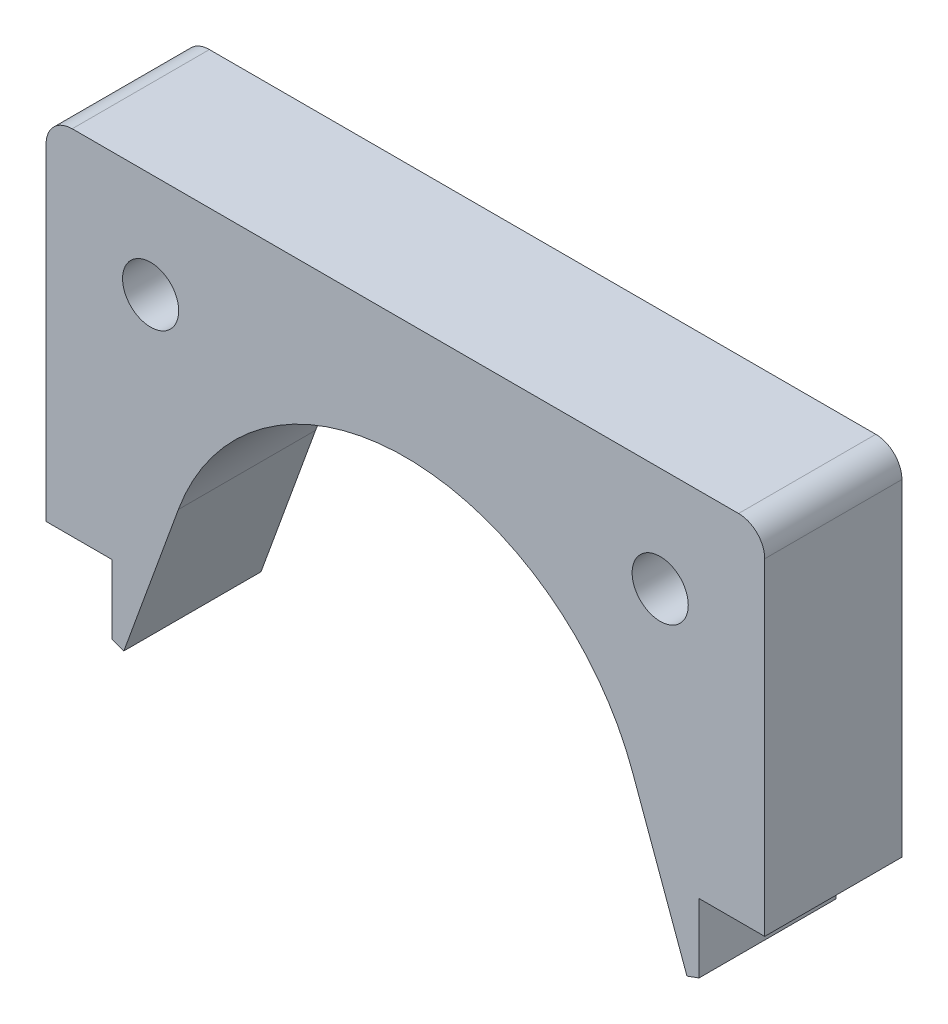
ISO-10303-21;
HEADER;
FILE_DESCRIPTION(('STEP AP214'),'2;1');
FILE_NAME('part.step','',(''),(''),'','','');
FILE_SCHEMA(('AUTOMOTIVE_DESIGN { 1 0 10303 214 1 1 1 1 }'));
ENDSEC;
DATA;
#1=APPLICATION_CONTEXT('core data for automotive mechanical design processes');
#2=APPLICATION_PROTOCOL_DEFINITION('international standard','automotive_design',2000,#1);
#3=PRODUCT_CONTEXT('',#1,'mechanical');
#4=PRODUCT('Part','Part','',(#3));
#5=PRODUCT_RELATED_PRODUCT_CATEGORY('part','',(#4));
#6=PRODUCT_DEFINITION_FORMATION('','',#4);
#7=PRODUCT_DEFINITION_CONTEXT('part definition',#1,'design');
#8=PRODUCT_DEFINITION('design','',#6,#7);
#9=PRODUCT_DEFINITION_SHAPE('','',#8);
#10=(LENGTH_UNIT() NAMED_UNIT(*) SI_UNIT(.MILLI.,.METRE.));
#11=(NAMED_UNIT(*) PLANE_ANGLE_UNIT() SI_UNIT($,.RADIAN.));
#12=(NAMED_UNIT(*) SI_UNIT($,.STERADIAN.) SOLID_ANGLE_UNIT());
#13=UNCERTAINTY_MEASURE_WITH_UNIT(LENGTH_MEASURE(1.E-05),#10,'distance_accuracy_value','');
#14=(GEOMETRIC_REPRESENTATION_CONTEXT(3) GLOBAL_UNCERTAINTY_ASSIGNED_CONTEXT((#13)) GLOBAL_UNIT_ASSIGNED_CONTEXT((#10,
#11,#12)) REPRESENTATION_CONTEXT('',''));
#15=CARTESIAN_POINT('',(0.,0.,0.));
#16=DIRECTION('',(0.,0.,1.));
#17=DIRECTION('',(1.,0.,0.));
#18=AXIS2_PLACEMENT_3D('',#15,#16,#17);
#19=CARTESIAN_POINT('',(36.4185981872808,-21.5595176241731,10.5));
#20=DIRECTION('',(0.,0.,-1.));
#21=DIRECTION('',(-1.,0.,0.));
#22=AXIS2_PLACEMENT_3D('',#19,#20,#21);
#23=PLANE('',#22);
#24=CARTESIAN_POINT('',(55.9185981872808,-2.05951762417312,10.5));
#25=DIRECTION('',(0.,0.,1.));
#26=DIRECTION('',(1.,0.,0.));
#27=AXIS2_PLACEMENT_3D('',#24,#25,#26);
#28=CIRCLE('',#27,2.15000000000002);
#29=CARTESIAN_POINT('',(58.0685981872808,-2.05951762417312,10.5));
#30=VERTEX_POINT('',#29);
#31=EDGE_CURVE('E269',#30,#30,#28,.T.);
#32=ORIENTED_EDGE('',*,*,#31,.F.);
#33=EDGE_LOOP('',(#32));
#34=FACE_BOUND('',#33,.T.);
#35=DIRECTION('',(0.,1.,0.));
#36=VECTOR('',#35,1.);
#37=CARTESIAN_POINT('',(63.9185981872808,-21.0906513065701,10.5));
#38=LINE('',#37,#36);
#39=CARTESIAN_POINT('',(63.9185981872808,-21.0906513065701,10.5));
#40=VERTEX_POINT('',#39);
#41=CARTESIAN_POINT('',(63.9185981872808,3.94048237582689,10.5));
#42=VERTEX_POINT('',#41);
#43=EDGE_CURVE('E180',#40,#42,#38,.T.);
#44=ORIENTED_EDGE('',*,*,#43,.T.);
#45=CARTESIAN_POINT('',(61.9185981872808,3.94048237582689,10.5));
#46=DIRECTION('',(0.,0.,-1.));
#47=DIRECTION('',(-1.,0.,0.));
#48=AXIS2_PLACEMENT_3D('',#45,#46,#47);
#49=CIRCLE('',#48,2.);
#50=CARTESIAN_POINT('',(61.9185981872808,5.94048237582689,10.5));
#51=VERTEX_POINT('',#50);
#52=EDGE_CURVE('E43',#42,#51,#49,.F.);
#53=ORIENTED_EDGE('',*,*,#52,.T.);
#54=DIRECTION('',(-1.,0.,0.));
#55=VECTOR('',#54,1.);
#56=CARTESIAN_POINT('',(63.9185981872808,5.94048237582689,10.5));
#57=LINE('',#56,#55);
#58=CARTESIAN_POINT('',(10.9185981872808,5.94048237582689,10.5));
#59=VERTEX_POINT('',#58);
#60=EDGE_CURVE('E179',#51,#59,#57,.T.);
#61=ORIENTED_EDGE('',*,*,#60,.T.);
#62=CARTESIAN_POINT('',(10.9185981872808,3.94048237582689,10.5));
#63=DIRECTION('',(0.,0.,-1.));
#64=DIRECTION('',(-1.,0.,0.));
#65=AXIS2_PLACEMENT_3D('',#62,#63,#64);
#66=CIRCLE('',#65,2.);
#67=CARTESIAN_POINT('',(8.91859818728076,3.94048237582689,10.5));
#68=VERTEX_POINT('',#67);
#69=EDGE_CURVE('E50',#59,#68,#66,.F.);
#70=ORIENTED_EDGE('',*,*,#69,.T.);
#71=DIRECTION('',(0.,-1.,0.));
#72=VECTOR('',#71,1.);
#73=CARTESIAN_POINT('',(8.91859818728076,5.94048237582689,10.5));
#74=LINE('',#73,#72);
#75=CARTESIAN_POINT('',(8.91859818728076,-21.0906513065701,10.5));
#76=VERTEX_POINT('',#75);
#77=EDGE_CURVE('E153',#68,#76,#74,.T.);
#78=ORIENTED_EDGE('',*,*,#77,.T.);
#79=DIRECTION('',(1.,0.,0.));
#80=VECTOR('',#79,1.);
#81=CARTESIAN_POINT('',(8.91859818728076,-21.0906513065701,10.5));
#82=LINE('',#81,#80);
#83=CARTESIAN_POINT('',(13.9441377314609,-21.0906513065701,10.5));
#84=VERTEX_POINT('',#83);
#85=EDGE_CURVE('E149',#76,#84,#82,.T.);
#86=ORIENTED_EDGE('',*,*,#85,.T.);
#87=DIRECTION('',(0.,-1.,0.));
#88=VECTOR('',#87,1.);
#89=CARTESIAN_POINT('',(13.9441377314609,-21.0906513065701,10.5));
#90=LINE('',#89,#88);
#91=CARTESIAN_POINT('',(13.9441377314609,-26.3610038868778,10.5));
#92=VERTEX_POINT('',#91);
#93=EDGE_CURVE('E139',#84,#92,#90,.T.);
#94=ORIENTED_EDGE('',*,*,#93,.T.);
#95=DIRECTION('',(0.939692620785909,-0.342020143325667,0.));
#96=VECTOR('',#95,1.);
#97=CARTESIAN_POINT('',(13.9441377314609,-26.3610038868778,10.5));
#98=LINE('',#97,#96);
#99=CARTESIAN_POINT('',(14.8693353880782,-26.6977482946993,10.5));
#100=VERTEX_POINT('',#99);
#101=EDGE_CURVE('E148',#92,#100,#98,.T.);
#102=ORIENTED_EDGE('',*,*,#101,.T.);
#103=DIRECTION('',(0.342020143325666,0.93969262078591,0.));
#104=VECTOR('',#103,1.);
#105=CARTESIAN_POINT('',(14.8693353880782,-26.6977482946993,10.5));
#106=LINE('',#105,#104);
#107=CARTESIAN_POINT('',(19.0415157827224,-15.234776870523,10.5));
#108=VERTEX_POINT('',#107);
#109=EDGE_CURVE('E234',#100,#108,#106,.T.);
#110=ORIENTED_EDGE('',*,*,#109,.T.);
#111=CARTESIAN_POINT('',(36.4185981872808,-21.5595176241731,10.5));
#112=DIRECTION('',(0.,0.,-1.));
#113=DIRECTION('',(-1.,0.,0.));
#114=AXIS2_PLACEMENT_3D('',#111,#112,#113);
#115=CIRCLE('',#114,18.4923048454133);
#116=CARTESIAN_POINT('',(53.7956805918391,-15.234776870523,10.5));
#117=VERTEX_POINT('',#116);
#118=EDGE_CURVE('E272',#108,#117,#115,.T.);
#119=ORIENTED_EDGE('',*,*,#118,.T.);
#120=DIRECTION('',(0.342020143325666,-0.939692620785909,0.));
#121=VECTOR('',#120,1.);
#122=CARTESIAN_POINT('',(53.7956805918391,-15.234776870523,10.5));
#123=LINE('',#122,#121);
#124=CARTESIAN_POINT('',(57.9678609864833,-26.6977482946993,10.5));
#125=VERTEX_POINT('',#124);
#126=EDGE_CURVE('E276',#117,#125,#123,.T.);
#127=ORIENTED_EDGE('',*,*,#126,.T.);
#128=DIRECTION('',(0.939692620785906,0.342020143325675,0.));
#129=VECTOR('',#128,1.);
#130=CARTESIAN_POINT('',(57.9678609864833,-26.6977482946993,10.5));
#131=LINE('',#130,#129);
#132=CARTESIAN_POINT('',(58.8930586431006,-26.3610038868778,10.5));
#133=VERTEX_POINT('',#132);
#134=EDGE_CURVE('E264',#125,#133,#131,.T.);
#135=ORIENTED_EDGE('',*,*,#134,.T.);
#136=DIRECTION('',(0.,1.,0.));
#137=VECTOR('',#136,1.);
#138=CARTESIAN_POINT('',(58.8930586431007,-21.0906513065701,10.5));
#139=LINE('',#138,#137);
#140=CARTESIAN_POINT('',(58.8930586431007,-21.0906513065701,10.5));
#141=VERTEX_POINT('',#140);
#142=EDGE_CURVE('E261',#133,#141,#139,.T.);
#143=ORIENTED_EDGE('',*,*,#142,.T.);
#144=DIRECTION('',(1.,0.,0.));
#145=VECTOR('',#144,1.);
#146=CARTESIAN_POINT('',(63.9185981872808,-21.0906513065701,10.5));
#147=LINE('',#146,#145);
#148=EDGE_CURVE('E260',#141,#40,#147,.T.);
#149=ORIENTED_EDGE('',*,*,#148,.T.);
#150=EDGE_LOOP('',(#44,#53,#61,#70,#78,#86,#94,#102,#110,#119,#127,#135,#143,#149));
#151=FACE_BOUND('',#150,.T.);
#152=CARTESIAN_POINT('',(16.9185981872808,-2.05951762417312,10.5));
#153=DIRECTION('',(0.,0.,1.));
#154=DIRECTION('',(1.,0.,0.));
#155=AXIS2_PLACEMENT_3D('',#152,#153,#154);
#156=CIRCLE('',#155,2.15);
#157=CARTESIAN_POINT('',(19.0685981872808,-2.05951762417312,10.5));
#158=VERTEX_POINT('',#157);
#159=EDGE_CURVE('E445',#158,#158,#156,.T.);
#160=ORIENTED_EDGE('',*,*,#159,.F.);
#161=EDGE_LOOP('',(#160));
#162=FACE_BOUND('',#161,.T.);
#163=ADVANCED_FACE('F35',(#34,#151,#162),#23,.F.);
#164=CARTESIAN_POINT('',(36.4185981872808,-21.5595176241731,0.));
#165=DIRECTION('',(0.,0.,-1.));
#166=DIRECTION('',(-1.,0.,0.));
#167=AXIS2_PLACEMENT_3D('',#164,#165,#166);
#168=PLANE('',#167);
#169=CARTESIAN_POINT('',(55.9185981872808,-2.05951762417312,0.));
#170=DIRECTION('',(0.,0.,1.));
#171=DIRECTION('',(1.,0.,0.));
#172=AXIS2_PLACEMENT_3D('',#169,#170,#171);
#173=CIRCLE('',#172,2.15000000000002);
#174=CARTESIAN_POINT('',(58.0685981872808,-2.05951762417312,0.));
#175=VERTEX_POINT('',#174);
#176=EDGE_CURVE('E450',#175,#175,#173,.T.);
#177=ORIENTED_EDGE('',*,*,#176,.T.);
#178=EDGE_LOOP('',(#177));
#179=FACE_BOUND('',#178,.T.);
#180=DIRECTION('',(-1.,0.,0.));
#181=VECTOR('',#180,1.);
#182=CARTESIAN_POINT('',(63.9185981872808,5.94048237582689,0.));
#183=LINE('',#182,#181);
#184=CARTESIAN_POINT('',(61.9185981872808,5.94048237582689,0.));
#185=VERTEX_POINT('',#184);
#186=CARTESIAN_POINT('',(10.9185981872808,5.94048237582689,0.));
#187=VERTEX_POINT('',#186);
#188=EDGE_CURVE('E196',#185,#187,#183,.T.);
#189=ORIENTED_EDGE('',*,*,#188,.F.);
#190=CARTESIAN_POINT('',(61.9185981872808,3.94048237582689,0.));
#191=DIRECTION('',(0.,0.,-1.));
#192=DIRECTION('',(-1.,0.,0.));
#193=AXIS2_PLACEMENT_3D('',#190,#191,#192);
#194=CIRCLE('',#193,2.);
#195=CARTESIAN_POINT('',(63.9185981872808,3.94048237582689,0.));
#196=VERTEX_POINT('',#195);
#197=EDGE_CURVE('E174',#185,#196,#194,.T.);
#198=ORIENTED_EDGE('',*,*,#197,.T.);
#199=DIRECTION('',(0.,1.,0.));
#200=VECTOR('',#199,1.);
#201=CARTESIAN_POINT('',(63.9185981872808,-21.0906513065701,0.));
#202=LINE('',#201,#200);
#203=CARTESIAN_POINT('',(63.9185981872808,-21.0906513065701,0.));
#204=VERTEX_POINT('',#203);
#205=EDGE_CURVE('E195',#204,#196,#202,.T.);
#206=ORIENTED_EDGE('',*,*,#205,.F.);
#207=DIRECTION('',(1.,0.,0.));
#208=VECTOR('',#207,1.);
#209=CARTESIAN_POINT('',(63.9185981872808,-21.0906513065701,0.));
#210=LINE('',#209,#208);
#211=CARTESIAN_POINT('',(58.8930586431007,-21.0906513065701,0.));
#212=VERTEX_POINT('',#211);
#213=EDGE_CURVE('E201',#212,#204,#210,.T.);
#214=ORIENTED_EDGE('',*,*,#213,.F.);
#215=DIRECTION('',(0.,1.,0.));
#216=VECTOR('',#215,1.);
#217=CARTESIAN_POINT('',(58.8930586431007,-21.0906513065701,0.));
#218=LINE('',#217,#216);
#219=CARTESIAN_POINT('',(58.8930586431006,-26.3610038868778,0.));
#220=VERTEX_POINT('',#219);
#221=EDGE_CURVE('E204',#220,#212,#218,.T.);
#222=ORIENTED_EDGE('',*,*,#221,.F.);
#223=DIRECTION('',(0.939692620785906,0.342020143325675,0.));
#224=VECTOR('',#223,1.);
#225=CARTESIAN_POINT('',(57.9678609864833,-26.6977482946993,0.));
#226=LINE('',#225,#224);
#227=CARTESIAN_POINT('',(57.9678609864833,-26.6977482946993,0.));
#228=VERTEX_POINT('',#227);
#229=EDGE_CURVE('E249',#228,#220,#226,.T.);
#230=ORIENTED_EDGE('',*,*,#229,.F.);
#231=DIRECTION('',(0.342020143325666,-0.939692620785909,0.));
#232=VECTOR('',#231,1.);
#233=CARTESIAN_POINT('',(53.7956805918391,-15.234776870523,0.));
#234=LINE('',#233,#232);
#235=CARTESIAN_POINT('',(53.7956805918391,-15.234776870523,0.));
#236=VERTEX_POINT('',#235);
#237=EDGE_CURVE('E242',#236,#228,#234,.T.);
#238=ORIENTED_EDGE('',*,*,#237,.F.);
#239=CARTESIAN_POINT('',(36.4185981872808,-21.5595176241731,0.));
#240=DIRECTION('',(0.,0.,-1.));
#241=DIRECTION('',(-1.,0.,0.));
#242=AXIS2_PLACEMENT_3D('',#239,#240,#241);
#243=CIRCLE('',#242,18.4923048454133);
#244=CARTESIAN_POINT('',(19.0415157827224,-15.234776870523,0.));
#245=VERTEX_POINT('',#244);
#246=EDGE_CURVE('E240',#245,#236,#243,.T.);
#247=ORIENTED_EDGE('',*,*,#246,.F.);
#248=DIRECTION('',(0.342020143325666,0.93969262078591,0.));
#249=VECTOR('',#248,1.);
#250=CARTESIAN_POINT('',(14.8693353880782,-26.6977482946993,0.));
#251=LINE('',#250,#249);
#252=CARTESIAN_POINT('',(14.8693353880782,-26.6977482946993,0.));
#253=VERTEX_POINT('',#252);
#254=EDGE_CURVE('E233',#253,#245,#251,.T.);
#255=ORIENTED_EDGE('',*,*,#254,.F.);
#256=DIRECTION('',(0.939692620785909,-0.342020143325667,0.));
#257=VECTOR('',#256,1.);
#258=CARTESIAN_POINT('',(13.9441377314609,-26.3610038868778,0.));
#259=LINE('',#258,#257);
#260=CARTESIAN_POINT('',(13.9441377314609,-26.3610038868778,0.));
#261=VERTEX_POINT('',#260);
#262=EDGE_CURVE('E238',#261,#253,#259,.T.);
#263=ORIENTED_EDGE('',*,*,#262,.F.);
#264=DIRECTION('',(0.,-1.,0.));
#265=VECTOR('',#264,1.);
#266=CARTESIAN_POINT('',(13.9441377314609,-21.0906513065701,0.));
#267=LINE('',#266,#265);
#268=CARTESIAN_POINT('',(13.9441377314609,-21.0906513065701,0.));
#269=VERTEX_POINT('',#268);
#270=EDGE_CURVE('E244',#269,#261,#267,.T.);
#271=ORIENTED_EDGE('',*,*,#270,.F.);
#272=DIRECTION('',(1.,0.,0.));
#273=VECTOR('',#272,1.);
#274=CARTESIAN_POINT('',(8.91859818728076,-21.0906513065701,0.));
#275=LINE('',#274,#273);
#276=CARTESIAN_POINT('',(8.91859818728076,-21.0906513065701,0.));
#277=VERTEX_POINT('',#276);
#278=EDGE_CURVE('E161',#277,#269,#275,.T.);
#279=ORIENTED_EDGE('',*,*,#278,.F.);
#280=DIRECTION('',(0.,-1.,0.));
#281=VECTOR('',#280,1.);
#282=CARTESIAN_POINT('',(8.91859818728076,5.94048237582689,0.));
#283=LINE('',#282,#281);
#284=CARTESIAN_POINT('',(8.91859818728076,3.94048237582689,0.));
#285=VERTEX_POINT('',#284);
#286=EDGE_CURVE('E157',#285,#277,#283,.T.);
#287=ORIENTED_EDGE('',*,*,#286,.F.);
#288=CARTESIAN_POINT('',(10.9185981872808,3.94048237582689,0.));
#289=DIRECTION('',(0.,0.,-1.));
#290=DIRECTION('',(-1.,0.,0.));
#291=AXIS2_PLACEMENT_3D('',#288,#289,#290);
#292=CIRCLE('',#291,2.);
#293=EDGE_CURVE('E172',#285,#187,#292,.T.);
#294=ORIENTED_EDGE('',*,*,#293,.T.);
#295=EDGE_LOOP('',(#189,#198,#206,#214,#222,#230,#238,#247,#255,#263,#271,#279,#287,#294));
#296=FACE_BOUND('',#295,.T.);
#297=CARTESIAN_POINT('',(16.9185981872808,-2.05951762417312,0.));
#298=DIRECTION('',(0.,0.,1.));
#299=DIRECTION('',(1.,0.,0.));
#300=AXIS2_PLACEMENT_3D('',#297,#298,#299);
#301=CIRCLE('',#300,2.15);
#302=CARTESIAN_POINT('',(19.0685981872808,-2.05951762417312,0.));
#303=VERTEX_POINT('',#302);
#304=EDGE_CURVE('E448',#303,#303,#301,.T.);
#305=ORIENTED_EDGE('',*,*,#304,.T.);
#306=EDGE_LOOP('',(#305));
#307=FACE_BOUND('',#306,.T.);
#308=ADVANCED_FACE('F192',(#179,#296,#307),#168,.T.);
#309=CARTESIAN_POINT('',(8.91859818728076,-21.0906513065701,10.5));
#310=DIRECTION('',(0.,1.,0.));
#311=DIRECTION('',(0.,0.,1.));
#312=AXIS2_PLACEMENT_3D('',#309,#310,#311);
#313=PLANE('',#312);
#314=ORIENTED_EDGE('',*,*,#278,.T.);
#315=DIRECTION('',(0.,0.,-1.));
#316=VECTOR('',#315,1.);
#317=CARTESIAN_POINT('',(13.9441377314609,-21.0906513065701,10.5));
#318=LINE('',#317,#316);
#319=EDGE_CURVE('E143',#84,#269,#318,.T.);
#320=ORIENTED_EDGE('',*,*,#319,.F.);
#321=ORIENTED_EDGE('',*,*,#85,.F.);
#322=DIRECTION('',(0.,0.,-1.));
#323=VECTOR('',#322,1.);
#324=CARTESIAN_POINT('',(8.91859818728076,-21.0906513065701,10.5));
#325=LINE('',#324,#323);
#326=EDGE_CURVE('E209',#76,#277,#325,.T.);
#327=ORIENTED_EDGE('',*,*,#326,.T.);
#328=EDGE_LOOP('',(#314,#320,#321,#327));
#329=FACE_BOUND('',#328,.T.);
#330=ADVANCED_FACE('F159',(#329),#313,.F.);
#331=CARTESIAN_POINT('',(13.9441377314609,-21.0906513065701,10.5));
#332=DIRECTION('',(1.,0.,0.));
#333=DIRECTION('',(0.,0.,-1.));
#334=AXIS2_PLACEMENT_3D('',#331,#332,#333);
#335=PLANE('',#334);
#336=ORIENTED_EDGE('',*,*,#270,.T.);
#337=DIRECTION('',(0.,0.,-1.));
#338=VECTOR('',#337,1.);
#339=CARTESIAN_POINT('',(13.9441377314609,-26.3610038868778,10.5));
#340=LINE('',#339,#338);
#341=EDGE_CURVE('E146',#92,#261,#340,.T.);
#342=ORIENTED_EDGE('',*,*,#341,.F.);
#343=ORIENTED_EDGE('',*,*,#93,.F.);
#344=ORIENTED_EDGE('',*,*,#319,.T.);
#345=EDGE_LOOP('',(#336,#342,#343,#344));
#346=FACE_BOUND('',#345,.T.);
#347=ADVANCED_FACE('F141',(#346),#335,.F.);
#348=CARTESIAN_POINT('',(13.9441377314609,-26.3610038868778,10.5));
#349=DIRECTION('',(0.342020143325667,0.939692620785909,0.));
#350=DIRECTION('',(-0.939692620785909,0.342020143325667,0.));
#351=AXIS2_PLACEMENT_3D('',#348,#349,#350);
#352=PLANE('',#351);
#353=ORIENTED_EDGE('',*,*,#262,.T.);
#354=DIRECTION('',(0.,0.,-1.));
#355=VECTOR('',#354,1.);
#356=CARTESIAN_POINT('',(14.8693353880782,-26.6977482946993,10.5));
#357=LINE('',#356,#355);
#358=EDGE_CURVE('E166',#100,#253,#357,.T.);
#359=ORIENTED_EDGE('',*,*,#358,.F.);
#360=ORIENTED_EDGE('',*,*,#101,.F.);
#361=ORIENTED_EDGE('',*,*,#341,.T.);
#362=EDGE_LOOP('',(#353,#359,#360,#361));
#363=FACE_BOUND('',#362,.T.);
#364=ADVANCED_FACE('F270',(#363),#352,.F.);
#365=CARTESIAN_POINT('',(14.8693353880782,-26.6977482946993,10.5));
#366=DIRECTION('',(-0.93969262078591,0.342020143325666,0.));
#367=DIRECTION('',(-0.342020143325666,-0.93969262078591,0.));
#368=AXIS2_PLACEMENT_3D('',#365,#366,#367);
#369=PLANE('',#368);
#370=ORIENTED_EDGE('',*,*,#254,.T.);
#371=DIRECTION('',(0.,0.,-1.));
#372=VECTOR('',#371,1.);
#373=CARTESIAN_POINT('',(19.0415157827224,-15.234776870523,10.5));
#374=LINE('',#373,#372);
#375=EDGE_CURVE('E224',#108,#245,#374,.T.);
#376=ORIENTED_EDGE('',*,*,#375,.F.);
#377=ORIENTED_EDGE('',*,*,#109,.F.);
#378=ORIENTED_EDGE('',*,*,#358,.T.);
#379=EDGE_LOOP('',(#370,#376,#377,#378));
#380=FACE_BOUND('',#379,.T.);
#381=ADVANCED_FACE('F231',(#380),#369,.F.);
#382=CARTESIAN_POINT('',(36.4185981872808,-21.5595176241731,10.5));
#383=DIRECTION('',(0.,0.,-1.));
#384=DIRECTION('',(-1.,0.,0.));
#385=AXIS2_PLACEMENT_3D('',#382,#383,#384);
#386=CYLINDRICAL_SURFACE('',#385,18.4923048454133);
#387=ORIENTED_EDGE('',*,*,#246,.T.);
#388=DIRECTION('',(0.,0.,-1.));
#389=VECTOR('',#388,1.);
#390=CARTESIAN_POINT('',(53.7956805918391,-15.234776870523,10.5));
#391=LINE('',#390,#389);
#392=EDGE_CURVE('E221',#117,#236,#391,.T.);
#393=ORIENTED_EDGE('',*,*,#392,.F.);
#394=ORIENTED_EDGE('',*,*,#118,.F.);
#395=ORIENTED_EDGE('',*,*,#375,.T.);
#396=EDGE_LOOP('',(#387,#393,#394,#395));
#397=FACE_BOUND('',#396,.T.);
#398=ADVANCED_FACE('F287',(#397),#386,.F.);
#399=CARTESIAN_POINT('',(53.7956805918391,-15.234776870523,10.5));
#400=DIRECTION('',(0.939692620785909,0.342020143325666,0.));
#401=DIRECTION('',(-0.342020143325666,0.939692620785909,0.));
#402=AXIS2_PLACEMENT_3D('',#399,#400,#401);
#403=PLANE('',#402);
#404=ORIENTED_EDGE('',*,*,#237,.T.);
#405=DIRECTION('',(0.,0.,-1.));
#406=VECTOR('',#405,1.);
#407=CARTESIAN_POINT('',(57.9678609864833,-26.6977482946993,10.5));
#408=LINE('',#407,#406);
#409=EDGE_CURVE('E218',#125,#228,#408,.T.);
#410=ORIENTED_EDGE('',*,*,#409,.F.);
#411=ORIENTED_EDGE('',*,*,#126,.F.);
#412=ORIENTED_EDGE('',*,*,#392,.T.);
#413=EDGE_LOOP('',(#404,#410,#411,#412));
#414=FACE_BOUND('',#413,.T.);
#415=ADVANCED_FACE('F283',(#414),#403,.F.);
#416=CARTESIAN_POINT('',(57.9678609864833,-26.6977482946993,10.5));
#417=DIRECTION('',(-0.342020143325675,0.939692620785906,0.));
#418=DIRECTION('',(-0.939692620785906,-0.342020143325675,0.));
#419=AXIS2_PLACEMENT_3D('',#416,#417,#418);
#420=PLANE('',#419);
#421=ORIENTED_EDGE('',*,*,#229,.T.);
#422=DIRECTION('',(0.,0.,-1.));
#423=VECTOR('',#422,1.);
#424=CARTESIAN_POINT('',(58.8930586431006,-26.3610038868778,10.5));
#425=LINE('',#424,#423);
#426=EDGE_CURVE('E215',#133,#220,#425,.T.);
#427=ORIENTED_EDGE('',*,*,#426,.F.);
#428=ORIENTED_EDGE('',*,*,#134,.F.);
#429=ORIENTED_EDGE('',*,*,#409,.T.);
#430=EDGE_LOOP('',(#421,#427,#428,#429));
#431=FACE_BOUND('',#430,.T.);
#432=ADVANCED_FACE('F281',(#431),#420,.F.);
#433=CARTESIAN_POINT('',(58.8930586431007,-21.0906513065701,10.5));
#434=DIRECTION('',(-1.,0.,0.));
#435=DIRECTION('',(0.,-1.,0.));
#436=AXIS2_PLACEMENT_3D('',#433,#434,#435);
#437=PLANE('',#436);
#438=ORIENTED_EDGE('',*,*,#221,.T.);
#439=DIRECTION('',(0.,0.,-1.));
#440=VECTOR('',#439,1.);
#441=CARTESIAN_POINT('',(58.8930586431007,-21.0906513065701,10.5));
#442=LINE('',#441,#440);
#443=EDGE_CURVE('E212',#141,#212,#442,.T.);
#444=ORIENTED_EDGE('',*,*,#443,.F.);
#445=ORIENTED_EDGE('',*,*,#142,.F.);
#446=ORIENTED_EDGE('',*,*,#426,.T.);
#447=EDGE_LOOP('',(#438,#444,#445,#446));
#448=FACE_BOUND('',#447,.T.);
#449=ADVANCED_FACE('F253',(#448),#437,.F.);
#450=CARTESIAN_POINT('',(63.9185981872808,-21.0906513065701,10.5));
#451=DIRECTION('',(0.,1.,0.));
#452=DIRECTION('',(0.,0.,1.));
#453=AXIS2_PLACEMENT_3D('',#450,#451,#452);
#454=PLANE('',#453);
#455=ORIENTED_EDGE('',*,*,#213,.T.);
#456=DIRECTION('',(0.,0.,-1.));
#457=VECTOR('',#456,1.);
#458=CARTESIAN_POINT('',(63.9185981872808,-21.0906513065701,10.5));
#459=LINE('',#458,#457);
#460=EDGE_CURVE('E200',#40,#204,#459,.T.);
#461=ORIENTED_EDGE('',*,*,#460,.F.);
#462=ORIENTED_EDGE('',*,*,#148,.F.);
#463=ORIENTED_EDGE('',*,*,#443,.T.);
#464=EDGE_LOOP('',(#455,#461,#462,#463));
#465=FACE_BOUND('',#464,.T.);
#466=ADVANCED_FACE('F259',(#465),#454,.F.);
#467=CARTESIAN_POINT('',(63.9185981872808,-21.0906513065701,10.5));
#468=DIRECTION('',(-1.,0.,0.));
#469=DIRECTION('',(0.,0.,1.));
#470=AXIS2_PLACEMENT_3D('',#467,#468,#469);
#471=PLANE('',#470);
#472=ORIENTED_EDGE('',*,*,#205,.T.);
#473=DIRECTION('',(0.,0.,-1.));
#474=VECTOR('',#473,1.);
#475=CARTESIAN_POINT('',(63.9185981872808,3.94048237582689,10.5));
#476=LINE('',#475,#474);
#477=EDGE_CURVE('E58',#196,#42,#476,.F.);
#478=ORIENTED_EDGE('',*,*,#477,.T.);
#479=ORIENTED_EDGE('',*,*,#43,.F.);
#480=ORIENTED_EDGE('',*,*,#460,.T.);
#481=EDGE_LOOP('',(#472,#478,#479,#480));
#482=FACE_BOUND('',#481,.T.);
#483=ADVANCED_FACE('F198',(#482),#471,.F.);
#484=CARTESIAN_POINT('',(63.9185981872808,5.94048237582689,10.5));
#485=DIRECTION('',(0.,-1.,0.));
#486=DIRECTION('',(0.,0.,-1.));
#487=AXIS2_PLACEMENT_3D('',#484,#485,#486);
#488=PLANE('',#487);
#489=ORIENTED_EDGE('',*,*,#60,.F.);
#490=DIRECTION('',(0.,0.,-1.));
#491=VECTOR('',#490,1.);
#492=CARTESIAN_POINT('',(61.9185981872808,5.94048237582689,10.5));
#493=LINE('',#492,#491);
#494=EDGE_CURVE('E164',#51,#185,#493,.T.);
#495=ORIENTED_EDGE('',*,*,#494,.T.);
#496=ORIENTED_EDGE('',*,*,#188,.T.);
#497=DIRECTION('',(0.,0.,-1.));
#498=VECTOR('',#497,1.);
#499=CARTESIAN_POINT('',(10.9185981872808,5.94048237582689,10.5));
#500=LINE('',#499,#498);
#501=EDGE_CURVE('E162',#187,#59,#500,.F.);
#502=ORIENTED_EDGE('',*,*,#501,.T.);
#503=EDGE_LOOP('',(#489,#495,#496,#502));
#504=FACE_BOUND('',#503,.T.);
#505=ADVANCED_FACE('F184',(#504),#488,.F.);
#506=CARTESIAN_POINT('',(8.91859818728076,5.94048237582689,10.5));
#507=DIRECTION('',(1.,0.,0.));
#508=DIRECTION('',(0.,0.,-1.));
#509=AXIS2_PLACEMENT_3D('',#506,#507,#508);
#510=PLANE('',#509);
#511=ORIENTED_EDGE('',*,*,#77,.F.);
#512=DIRECTION('',(0.,0.,-1.));
#513=VECTOR('',#512,1.);
#514=CARTESIAN_POINT('',(8.91859818728076,3.94048237582689,10.5));
#515=LINE('',#514,#513);
#516=EDGE_CURVE('E11',#68,#285,#515,.T.);
#517=ORIENTED_EDGE('',*,*,#516,.T.);
#518=ORIENTED_EDGE('',*,*,#286,.T.);
#519=ORIENTED_EDGE('',*,*,#326,.F.);
#520=EDGE_LOOP('',(#511,#517,#518,#519));
#521=FACE_BOUND('',#520,.T.);
#522=ADVANCED_FACE('F309',(#521),#510,.F.);
#523=CARTESIAN_POINT('',(55.9185981872808,-2.05951762417312,10.5));
#524=DIRECTION('',(0.,0.,-1.));
#525=DIRECTION('',(-1.,0.,0.));
#526=AXIS2_PLACEMENT_3D('',#523,#524,#525);
#527=CYLINDRICAL_SURFACE('',#526,2.15000000000002);
#528=ORIENTED_EDGE('',*,*,#31,.T.);
#529=EDGE_LOOP('',(#528));
#530=FACE_BOUND('',#529,.T.);
#531=ORIENTED_EDGE('',*,*,#176,.F.);
#532=EDGE_LOOP('',(#531));
#533=FACE_BOUND('',#532,.T.);
#534=ADVANCED_FACE('F306',(#530,#533),#527,.F.);
#535=CARTESIAN_POINT('',(16.9185981872808,-2.05951762417312,10.5));
#536=DIRECTION('',(0.,0.,-1.));
#537=DIRECTION('',(-1.,0.,0.));
#538=AXIS2_PLACEMENT_3D('',#535,#536,#537);
#539=CYLINDRICAL_SURFACE('',#538,2.15);
#540=ORIENTED_EDGE('',*,*,#159,.T.);
#541=EDGE_LOOP('',(#540));
#542=FACE_BOUND('',#541,.T.);
#543=ORIENTED_EDGE('',*,*,#304,.F.);
#544=EDGE_LOOP('',(#543));
#545=FACE_BOUND('',#544,.T.);
#546=ADVANCED_FACE('F354',(#542,#545),#539,.F.);
#547=CARTESIAN_POINT('',(61.9185981872808,3.94048237582689,10.5));
#548=DIRECTION('',(0.,0.,-1.));
#549=DIRECTION('',(-1.,0.,0.));
#550=AXIS2_PLACEMENT_3D('',#547,#548,#549);
#551=CYLINDRICAL_SURFACE('',#550,2.);
#552=ORIENTED_EDGE('',*,*,#52,.F.);
#553=ORIENTED_EDGE('',*,*,#477,.F.);
#554=ORIENTED_EDGE('',*,*,#197,.F.);
#555=ORIENTED_EDGE('',*,*,#494,.F.);
#556=EDGE_LOOP('',(#552,#553,#554,#555));
#557=FACE_BOUND('',#556,.T.);
#558=ADVANCED_FACE('F189',(#557),#551,.T.);
#559=CARTESIAN_POINT('',(10.9185981872808,3.94048237582689,10.5));
#560=DIRECTION('',(0.,0.,-1.));
#561=DIRECTION('',(-1.,0.,0.));
#562=AXIS2_PLACEMENT_3D('',#559,#560,#561);
#563=CYLINDRICAL_SURFACE('',#562,2.);
#564=ORIENTED_EDGE('',*,*,#69,.F.);
#565=ORIENTED_EDGE('',*,*,#501,.F.);
#566=ORIENTED_EDGE('',*,*,#293,.F.);
#567=ORIENTED_EDGE('',*,*,#516,.F.);
#568=EDGE_LOOP('',(#564,#565,#566,#567));
#569=FACE_BOUND('',#568,.T.);
#570=ADVANCED_FACE('F37',(#569),#563,.T.);
#571=CLOSED_SHELL('',(#163,#308,#330,#347,#364,#381,#398,#415,#432,#449,#466,#483,#505,#522,
#534,#546,#558,#570));
#572=MANIFOLD_SOLID_BREP('B2',#571);
#573=ADVANCED_BREP_SHAPE_REPRESENTATION('',(#18,#572),#14);
#574=SHAPE_DEFINITION_REPRESENTATION(#9,#573);
ENDSEC;
END-ISO-10303-21;
